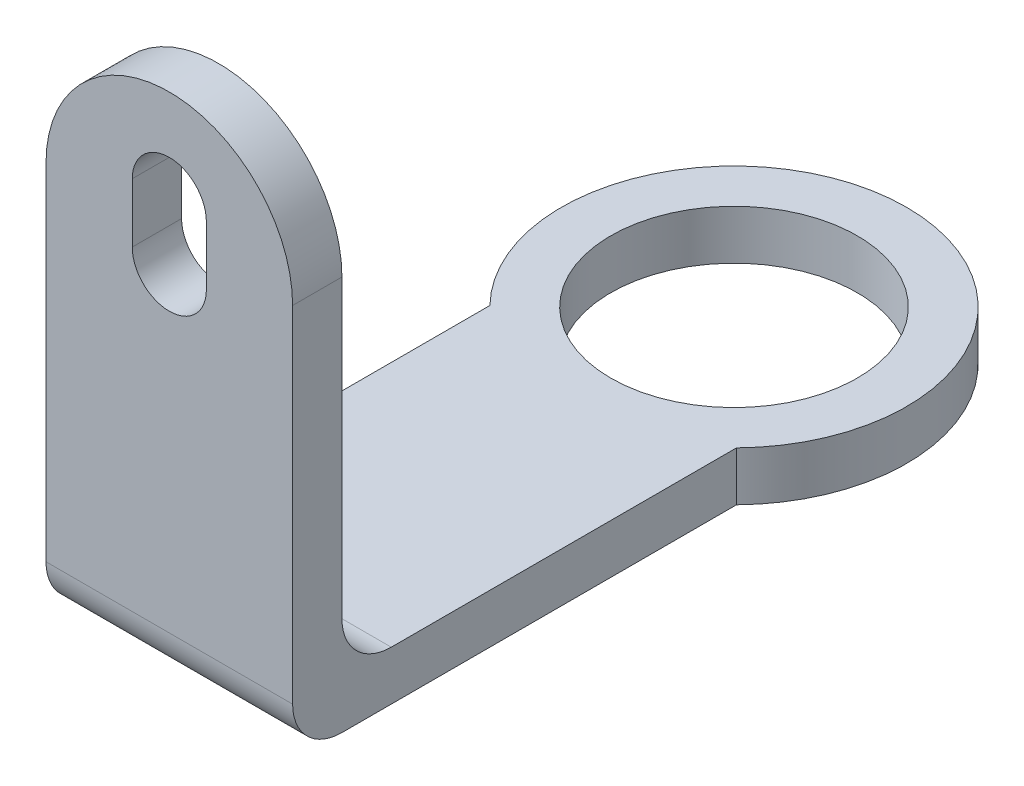
ISO-10303-21;
HEADER;
FILE_DESCRIPTION(('STEP AP214'),'2;1');
FILE_NAME('part.step','',(''),(''),'','','');
FILE_SCHEMA(('AUTOMOTIVE_DESIGN { 1 0 10303 214 1 1 1 1 }'));
ENDSEC;
DATA;
#1=APPLICATION_CONTEXT('core data for automotive mechanical design processes');
#2=APPLICATION_PROTOCOL_DEFINITION('international standard','automotive_design',2000,#1);
#3=PRODUCT_CONTEXT('',#1,'mechanical');
#4=PRODUCT('Part','Part','',(#3));
#5=PRODUCT_RELATED_PRODUCT_CATEGORY('part','',(#4));
#6=PRODUCT_DEFINITION_FORMATION('','',#4);
#7=PRODUCT_DEFINITION_CONTEXT('part definition',#1,'design');
#8=PRODUCT_DEFINITION('design','',#6,#7);
#9=PRODUCT_DEFINITION_SHAPE('','',#8);
#10=(LENGTH_UNIT() NAMED_UNIT(*) SI_UNIT(.MILLI.,.METRE.));
#11=(NAMED_UNIT(*) PLANE_ANGLE_UNIT() SI_UNIT($,.RADIAN.));
#12=(NAMED_UNIT(*) SI_UNIT($,.STERADIAN.) SOLID_ANGLE_UNIT());
#13=UNCERTAINTY_MEASURE_WITH_UNIT(LENGTH_MEASURE(1.E-05),#10,'distance_accuracy_value','');
#14=(GEOMETRIC_REPRESENTATION_CONTEXT(3) GLOBAL_UNCERTAINTY_ASSIGNED_CONTEXT((#13)) GLOBAL_UNIT_ASSIGNED_CONTEXT((#10,
#11,#12)) REPRESENTATION_CONTEXT('',''));
#15=CARTESIAN_POINT('',(0.,0.,0.));
#16=DIRECTION('',(0.,0.,1.));
#17=DIRECTION('',(1.,0.,0.));
#18=AXIS2_PLACEMENT_3D('',#15,#16,#17);
#19=CARTESIAN_POINT('',(0.,1.,0.));
#20=DIRECTION('',(0.,1.,0.));
#21=DIRECTION('',(0.,0.,1.));
#22=AXIS2_PLACEMENT_3D('',#19,#20,#21);
#23=PLANE('',#22);
#24=DIRECTION('',(0.,0.,1.));
#25=VECTOR('',#24,1.);
#26=CARTESIAN_POINT('',(-2.5,1.,2.44948974278318));
#27=LINE('',#26,#25);
#28=CARTESIAN_POINT('',(-2.5,1.,2.44948974278318));
#29=VERTEX_POINT('',#28);
#30=CARTESIAN_POINT('',(-2.5,1.,9.44948974278318));
#31=VERTEX_POINT('',#30);
#32=EDGE_CURVE('E196',#29,#31,#27,.T.);
#33=ORIENTED_EDGE('',*,*,#32,.T.);
#34=DIRECTION('',(1.,0.,0.));
#35=VECTOR('',#34,1.);
#36=CARTESIAN_POINT('',(0.,1.,9.44948974278318));
#37=LINE('',#36,#35);
#38=CARTESIAN_POINT('',(2.5,1.,9.44948974278318));
#39=VERTEX_POINT('',#38);
#40=EDGE_CURVE('E209',#31,#39,#37,.T.);
#41=ORIENTED_EDGE('',*,*,#40,.T.);
#42=DIRECTION('',(0.,0.,-1.));
#43=VECTOR('',#42,1.);
#44=CARTESIAN_POINT('',(2.5,1.,2.44948974278318));
#45=LINE('',#44,#43);
#46=CARTESIAN_POINT('',(2.5,1.,2.44948974278318));
#47=VERTEX_POINT('',#46);
#48=EDGE_CURVE('E191',#39,#47,#45,.T.);
#49=ORIENTED_EDGE('',*,*,#48,.T.);
#50=CARTESIAN_POINT('',(0.,1.,0.));
#51=DIRECTION('',(0.,1.,0.));
#52=DIRECTION('',(0.,0.,1.));
#53=AXIS2_PLACEMENT_3D('',#50,#51,#52);
#54=CIRCLE('',#53,3.5);
#55=EDGE_CURVE('E193',#47,#29,#54,.T.);
#56=ORIENTED_EDGE('',*,*,#55,.T.);
#57=EDGE_LOOP('',(#33,#41,#49,#56));
#58=FACE_BOUND('',#57,.T.);
#59=CARTESIAN_POINT('',(0.,1.,0.));
#60=DIRECTION('',(0.,1.,0.));
#61=DIRECTION('',(0.,0.,1.));
#62=AXIS2_PLACEMENT_3D('',#59,#60,#61);
#63=CIRCLE('',#62,2.5);
#64=CARTESIAN_POINT('',(0.,1.,2.5));
#65=VERTEX_POINT('',#64);
#66=EDGE_CURVE('E185',#65,#65,#63,.T.);
#67=ORIENTED_EDGE('',*,*,#66,.F.);
#68=EDGE_LOOP('',(#67));
#69=FACE_BOUND('',#68,.T.);
#70=ADVANCED_FACE('F33',(#58,#69),#23,.T.);
#71=CARTESIAN_POINT('',(0.,0.,0.));
#72=DIRECTION('',(0.,1.,0.));
#73=DIRECTION('',(0.,0.,1.));
#74=AXIS2_PLACEMENT_3D('',#71,#72,#73);
#75=PLANE('',#74);
#76=DIRECTION('',(0.,0.,-1.));
#77=VECTOR('',#76,1.);
#78=CARTESIAN_POINT('',(2.5,0.,2.44948974278318));
#79=LINE('',#78,#77);
#80=CARTESIAN_POINT('',(2.5,0.,10.4494897427832));
#81=VERTEX_POINT('',#80);
#82=CARTESIAN_POINT('',(2.5,0.,2.44948974278318));
#83=VERTEX_POINT('',#82);
#84=EDGE_CURVE('E188',#81,#83,#79,.T.);
#85=ORIENTED_EDGE('',*,*,#84,.F.);
#86=DIRECTION('',(1.,0.,0.));
#87=VECTOR('',#86,1.);
#88=CARTESIAN_POINT('',(-2.5,0.,10.4494897427832));
#89=LINE('',#88,#87);
#90=CARTESIAN_POINT('',(-2.5,0.,10.4494897427832));
#91=VERTEX_POINT('',#90);
#92=EDGE_CURVE('E48',#81,#91,#89,.F.);
#93=ORIENTED_EDGE('',*,*,#92,.T.);
#94=DIRECTION('',(0.,0.,1.));
#95=VECTOR('',#94,1.);
#96=CARTESIAN_POINT('',(-2.5,0.,2.44948974278318));
#97=LINE('',#96,#95);
#98=CARTESIAN_POINT('',(-2.5,0.,2.44948974278318));
#99=VERTEX_POINT('',#98);
#100=EDGE_CURVE('E194',#99,#91,#97,.T.);
#101=ORIENTED_EDGE('',*,*,#100,.F.);
#102=CARTESIAN_POINT('',(0.,0.,0.));
#103=DIRECTION('',(0.,1.,0.));
#104=DIRECTION('',(0.,0.,1.));
#105=AXIS2_PLACEMENT_3D('',#102,#103,#104);
#106=CIRCLE('',#105,3.5);
#107=EDGE_CURVE('E201',#83,#99,#106,.T.);
#108=ORIENTED_EDGE('',*,*,#107,.F.);
#109=EDGE_LOOP('',(#85,#93,#101,#108));
#110=FACE_BOUND('',#109,.T.);
#111=CARTESIAN_POINT('',(0.,0.,0.));
#112=DIRECTION('',(0.,1.,0.));
#113=DIRECTION('',(0.,0.,1.));
#114=AXIS2_PLACEMENT_3D('',#111,#112,#113);
#115=CIRCLE('',#114,2.5);
#116=CARTESIAN_POINT('',(0.,0.,2.5));
#117=VERTEX_POINT('',#116);
#118=EDGE_CURVE('E184',#117,#117,#115,.T.);
#119=ORIENTED_EDGE('',*,*,#118,.T.);
#120=EDGE_LOOP('',(#119));
#121=FACE_BOUND('',#120,.T.);
#122=ADVANCED_FACE('F246',(#110,#121),#75,.F.);
#123=CARTESIAN_POINT('',(2.5,1.,2.44948974278318));
#124=DIRECTION('',(-1.,0.,0.));
#125=DIRECTION('',(0.,0.,1.));
#126=AXIS2_PLACEMENT_3D('',#123,#124,#125);
#127=PLANE('',#126);
#128=DIRECTION('',(0.,1.,0.));
#129=VECTOR('',#128,1.);
#130=CARTESIAN_POINT('',(2.5,0.,11.4494897427832));
#131=LINE('',#130,#129);
#132=CARTESIAN_POINT('',(2.5,1.,11.4494897427832));
#133=VERTEX_POINT('',#132);
#134=CARTESIAN_POINT('',(2.5,8.,11.4494897427832));
#135=VERTEX_POINT('',#134);
#136=EDGE_CURVE('E165',#133,#135,#131,.T.);
#137=ORIENTED_EDGE('',*,*,#136,.F.);
#138=CARTESIAN_POINT('',(2.5,1.,10.4494897427832));
#139=DIRECTION('',(-1.,0.,0.));
#140=DIRECTION('',(0.,0.,1.));
#141=AXIS2_PLACEMENT_3D('',#138,#139,#140);
#142=CIRCLE('',#141,1.);
#143=EDGE_CURVE('E56',#133,#81,#142,.F.);
#144=ORIENTED_EDGE('',*,*,#143,.T.);
#145=ORIENTED_EDGE('',*,*,#84,.T.);
#146=DIRECTION('',(0.,-1.,0.));
#147=VECTOR('',#146,1.);
#148=CARTESIAN_POINT('',(2.5,1.,2.44948974278318));
#149=LINE('',#148,#147);
#150=EDGE_CURVE('E206',#47,#83,#149,.T.);
#151=ORIENTED_EDGE('',*,*,#150,.F.);
#152=ORIENTED_EDGE('',*,*,#48,.F.);
#153=CARTESIAN_POINT('',(2.5,2.,9.44948974278318));
#154=DIRECTION('',(-1.,0.,0.));
#155=DIRECTION('',(0.,0.,1.));
#156=AXIS2_PLACEMENT_3D('',#153,#154,#155);
#157=CIRCLE('',#156,1.);
#158=CARTESIAN_POINT('',(2.5,2.,10.4494897427832));
#159=VERTEX_POINT('',#158);
#160=EDGE_CURVE('E41',#39,#159,#157,.T.);
#161=ORIENTED_EDGE('',*,*,#160,.T.);
#162=DIRECTION('',(0.,1.,0.));
#163=VECTOR('',#162,1.);
#164=CARTESIAN_POINT('',(2.5,0.,10.4494897427832));
#165=LINE('',#164,#163);
#166=CARTESIAN_POINT('',(2.5,8.,10.4494897427832));
#167=VERTEX_POINT('',#166);
#168=EDGE_CURVE('E141',#159,#167,#165,.T.);
#169=ORIENTED_EDGE('',*,*,#168,.T.);
#170=DIRECTION('',(0.,0.,-1.));
#171=VECTOR('',#170,1.);
#172=CARTESIAN_POINT('',(2.5,8.,11.4494897427832));
#173=LINE('',#172,#171);
#174=EDGE_CURVE('E181',#135,#167,#173,.T.);
#175=ORIENTED_EDGE('',*,*,#174,.F.);
#176=EDGE_LOOP('',(#137,#144,#145,#151,#152,#161,#169,#175));
#177=FACE_BOUND('',#176,.T.);
#178=ADVANCED_FACE('F222',(#177),#127,.F.);
#179=CARTESIAN_POINT('',(0.,1.,0.));
#180=DIRECTION('',(0.,-1.,0.));
#181=DIRECTION('',(0.,0.,-1.));
#182=AXIS2_PLACEMENT_3D('',#179,#180,#181);
#183=CYLINDRICAL_SURFACE('',#182,3.5);
#184=ORIENTED_EDGE('',*,*,#107,.T.);
#185=DIRECTION('',(0.,-1.,0.));
#186=VECTOR('',#185,1.);
#187=CARTESIAN_POINT('',(-2.5,1.,2.44948974278318));
#188=LINE('',#187,#186);
#189=EDGE_CURVE('E199',#29,#99,#188,.T.);
#190=ORIENTED_EDGE('',*,*,#189,.F.);
#191=ORIENTED_EDGE('',*,*,#55,.F.);
#192=ORIENTED_EDGE('',*,*,#150,.T.);
#193=EDGE_LOOP('',(#184,#190,#191,#192));
#194=FACE_BOUND('',#193,.T.);
#195=ADVANCED_FACE('F243',(#194),#183,.T.);
#196=CARTESIAN_POINT('',(-2.5,1.,2.44948974278318));
#197=DIRECTION('',(1.,0.,0.));
#198=DIRECTION('',(0.,0.,-1.));
#199=AXIS2_PLACEMENT_3D('',#196,#197,#198);
#200=PLANE('',#199);
#201=ORIENTED_EDGE('',*,*,#100,.T.);
#202=CARTESIAN_POINT('',(-2.5,1.,10.4494897427832));
#203=DIRECTION('',(1.,0.,0.));
#204=DIRECTION('',(0.,0.,-1.));
#205=AXIS2_PLACEMENT_3D('',#202,#203,#204);
#206=CIRCLE('',#205,1.);
#207=CARTESIAN_POINT('',(-2.5,1.,11.4494897427832));
#208=VERTEX_POINT('',#207);
#209=EDGE_CURVE('E219',#91,#208,#206,.F.);
#210=ORIENTED_EDGE('',*,*,#209,.T.);
#211=DIRECTION('',(0.,-1.,0.));
#212=VECTOR('',#211,1.);
#213=CARTESIAN_POINT('',(-2.5,0.,11.4494897427832));
#214=LINE('',#213,#212);
#215=CARTESIAN_POINT('',(-2.5,8.,11.4494897427832));
#216=VERTEX_POINT('',#215);
#217=EDGE_CURVE('E170',#216,#208,#214,.T.);
#218=ORIENTED_EDGE('',*,*,#217,.F.);
#219=DIRECTION('',(0.,0.,-1.));
#220=VECTOR('',#219,1.);
#221=CARTESIAN_POINT('',(-2.5,8.,11.4494897427832));
#222=LINE('',#221,#220);
#223=CARTESIAN_POINT('',(-2.5,8.,10.4494897427832));
#224=VERTEX_POINT('',#223);
#225=EDGE_CURVE('E173',#216,#224,#222,.T.);
#226=ORIENTED_EDGE('',*,*,#225,.T.);
#227=DIRECTION('',(0.,-1.,0.));
#228=VECTOR('',#227,1.);
#229=CARTESIAN_POINT('',(-2.5,0.,10.4494897427832));
#230=LINE('',#229,#228);
#231=CARTESIAN_POINT('',(-2.5,2.,10.4494897427832));
#232=VERTEX_POINT('',#231);
#233=EDGE_CURVE('E168',#224,#232,#230,.T.);
#234=ORIENTED_EDGE('',*,*,#233,.T.);
#235=CARTESIAN_POINT('',(-2.5,2.,9.44948974278318));
#236=DIRECTION('',(1.,0.,0.));
#237=DIRECTION('',(0.,0.,-1.));
#238=AXIS2_PLACEMENT_3D('',#235,#236,#237);
#239=CIRCLE('',#238,1.);
#240=EDGE_CURVE('E11',#232,#31,#239,.T.);
#241=ORIENTED_EDGE('',*,*,#240,.T.);
#242=ORIENTED_EDGE('',*,*,#32,.F.);
#243=ORIENTED_EDGE('',*,*,#189,.T.);
#244=EDGE_LOOP('',(#201,#210,#218,#226,#234,#241,#242,#243));
#245=FACE_BOUND('',#244,.T.);
#246=ADVANCED_FACE('F237',(#245),#200,.F.);
#247=CARTESIAN_POINT('',(0.,1.,0.));
#248=DIRECTION('',(0.,-1.,0.));
#249=DIRECTION('',(0.,0.,-1.));
#250=AXIS2_PLACEMENT_3D('',#247,#248,#249);
#251=CYLINDRICAL_SURFACE('',#250,2.5);
#252=ORIENTED_EDGE('',*,*,#66,.T.);
#253=EDGE_LOOP('',(#252));
#254=FACE_BOUND('',#253,.T.);
#255=ORIENTED_EDGE('',*,*,#118,.F.);
#256=EDGE_LOOP('',(#255));
#257=FACE_BOUND('',#256,.T.);
#258=ADVANCED_FACE('F271',(#254,#257),#251,.F.);
#259=CARTESIAN_POINT('',(0.,8.,11.4494897427832));
#260=DIRECTION('',(0.,0.,1.));
#261=DIRECTION('',(1.,0.,0.));
#262=AXIS2_PLACEMENT_3D('',#259,#260,#261);
#263=PLANE('',#262);
#264=ORIENTED_EDGE('',*,*,#217,.T.);
#265=DIRECTION('',(1.,0.,0.));
#266=VECTOR('',#265,1.);
#267=CARTESIAN_POINT('',(2.5,1.,11.4494897427832));
#268=LINE('',#267,#266);
#269=EDGE_CURVE('E214',#208,#133,#268,.T.);
#270=ORIENTED_EDGE('',*,*,#269,.T.);
#271=ORIENTED_EDGE('',*,*,#136,.T.);
#272=CARTESIAN_POINT('',(0.,8.,11.4494897427832));
#273=DIRECTION('',(0.,0.,1.));
#274=DIRECTION('',(1.,0.,0.));
#275=AXIS2_PLACEMENT_3D('',#272,#273,#274);
#276=CIRCLE('',#275,2.5);
#277=EDGE_CURVE('E167',#135,#216,#276,.T.);
#278=ORIENTED_EDGE('',*,*,#277,.T.);
#279=EDGE_LOOP('',(#264,#270,#271,#278));
#280=FACE_BOUND('',#279,.T.);
#281=DIRECTION('',(0.,1.,0.));
#282=VECTOR('',#281,1.);
#283=CARTESIAN_POINT('',(0.751190726614225,7.4,11.4494897427832));
#284=LINE('',#283,#282);
#285=CARTESIAN_POINT('',(0.751190726614225,7.4,11.4494897427832));
#286=VERTEX_POINT('',#285);
#287=CARTESIAN_POINT('',(0.751190726614225,8.6,11.4494897427832));
#288=VERTEX_POINT('',#287);
#289=EDGE_CURVE('E133',#286,#288,#284,.T.);
#290=ORIENTED_EDGE('',*,*,#289,.F.);
#291=CARTESIAN_POINT('',(0.,7.4,11.4494897427832));
#292=DIRECTION('',(0.,0.,1.));
#293=DIRECTION('',(1.,0.,0.));
#294=AXIS2_PLACEMENT_3D('',#291,#292,#293);
#295=CIRCLE('',#294,0.751190726614222);
#296=CARTESIAN_POINT('',(-0.751190726614218,7.4,11.4494897427832));
#297=VERTEX_POINT('',#296);
#298=EDGE_CURVE('E123',#297,#286,#295,.T.);
#299=ORIENTED_EDGE('',*,*,#298,.F.);
#300=DIRECTION('',(0.,-1.,0.));
#301=VECTOR('',#300,1.);
#302=CARTESIAN_POINT('',(-0.751190726614218,7.4,11.4494897427832));
#303=LINE('',#302,#301);
#304=CARTESIAN_POINT('',(-0.751190726614218,8.6,11.4494897427832));
#305=VERTEX_POINT('',#304);
#306=EDGE_CURVE('E149',#305,#297,#303,.T.);
#307=ORIENTED_EDGE('',*,*,#306,.F.);
#308=CARTESIAN_POINT('',(0.,8.6,11.4494897427832));
#309=DIRECTION('',(0.,0.,1.));
#310=DIRECTION('',(1.,0.,0.));
#311=AXIS2_PLACEMENT_3D('',#308,#309,#310);
#312=CIRCLE('',#311,0.751190726614222);
#313=EDGE_CURVE('E147',#288,#305,#312,.T.);
#314=ORIENTED_EDGE('',*,*,#313,.F.);
#315=EDGE_LOOP('',(#290,#299,#307,#314));
#316=FACE_BOUND('',#315,.T.);
#317=ADVANCED_FACE('F145',(#280,#316),#263,.T.);
#318=CARTESIAN_POINT('',(0.,8.,10.4494897427832));
#319=DIRECTION('',(0.,0.,1.));
#320=DIRECTION('',(1.,0.,0.));
#321=AXIS2_PLACEMENT_3D('',#318,#319,#320);
#322=PLANE('',#321);
#323=ORIENTED_EDGE('',*,*,#168,.F.);
#324=DIRECTION('',(1.,0.,0.));
#325=VECTOR('',#324,1.);
#326=CARTESIAN_POINT('',(0.,2.,10.4494897427832));
#327=LINE('',#326,#325);
#328=EDGE_CURVE('E212',#159,#232,#327,.F.);
#329=ORIENTED_EDGE('',*,*,#328,.T.);
#330=ORIENTED_EDGE('',*,*,#233,.F.);
#331=CARTESIAN_POINT('',(0.,8.,10.4494897427832));
#332=DIRECTION('',(0.,0.,1.));
#333=DIRECTION('',(1.,0.,0.));
#334=AXIS2_PLACEMENT_3D('',#331,#332,#333);
#335=CIRCLE('',#334,2.5);
#336=EDGE_CURVE('E175',#167,#224,#335,.T.);
#337=ORIENTED_EDGE('',*,*,#336,.F.);
#338=EDGE_LOOP('',(#323,#329,#330,#337));
#339=FACE_BOUND('',#338,.T.);
#340=CARTESIAN_POINT('',(0.,7.4,10.4494897427832));
#341=DIRECTION('',(0.,0.,1.));
#342=DIRECTION('',(1.,0.,0.));
#343=AXIS2_PLACEMENT_3D('',#340,#341,#342);
#344=CIRCLE('',#343,0.751190726614222);
#345=CARTESIAN_POINT('',(-0.751190726614218,7.4,10.4494897427832));
#346=VERTEX_POINT('',#345);
#347=CARTESIAN_POINT('',(0.751190726614225,7.4,10.4494897427832));
#348=VERTEX_POINT('',#347);
#349=EDGE_CURVE('E153',#346,#348,#344,.T.);
#350=ORIENTED_EDGE('',*,*,#349,.T.);
#351=DIRECTION('',(0.,1.,0.));
#352=VECTOR('',#351,1.);
#353=CARTESIAN_POINT('',(0.751190726614225,7.4,10.4494897427832));
#354=LINE('',#353,#352);
#355=CARTESIAN_POINT('',(0.751190726614225,8.6,10.4494897427832));
#356=VERTEX_POINT('',#355);
#357=EDGE_CURVE('E140',#348,#356,#354,.T.);
#358=ORIENTED_EDGE('',*,*,#357,.T.);
#359=CARTESIAN_POINT('',(0.,8.6,10.4494897427832));
#360=DIRECTION('',(0.,0.,1.));
#361=DIRECTION('',(1.,0.,0.));
#362=AXIS2_PLACEMENT_3D('',#359,#360,#361);
#363=CIRCLE('',#362,0.751190726614222);
#364=CARTESIAN_POINT('',(-0.751190726614218,8.6,10.4494897427832));
#365=VERTEX_POINT('',#364);
#366=EDGE_CURVE('E156',#356,#365,#363,.T.);
#367=ORIENTED_EDGE('',*,*,#366,.T.);
#368=DIRECTION('',(0.,-1.,0.));
#369=VECTOR('',#368,1.);
#370=CARTESIAN_POINT('',(-0.751190726614218,7.4,10.4494897427832));
#371=LINE('',#370,#369);
#372=EDGE_CURVE('E134',#365,#346,#371,.T.);
#373=ORIENTED_EDGE('',*,*,#372,.T.);
#374=EDGE_LOOP('',(#350,#358,#367,#373));
#375=FACE_BOUND('',#374,.T.);
#376=ADVANCED_FACE('F230',(#339,#375),#322,.F.);
#377=CARTESIAN_POINT('',(0.,8.,11.4494897427832));
#378=DIRECTION('',(0.,0.,-1.));
#379=DIRECTION('',(-1.,0.,0.));
#380=AXIS2_PLACEMENT_3D('',#377,#378,#379);
#381=CYLINDRICAL_SURFACE('',#380,2.5);
#382=ORIENTED_EDGE('',*,*,#336,.T.);
#383=ORIENTED_EDGE('',*,*,#225,.F.);
#384=ORIENTED_EDGE('',*,*,#277,.F.);
#385=ORIENTED_EDGE('',*,*,#174,.T.);
#386=EDGE_LOOP('',(#382,#383,#384,#385));
#387=FACE_BOUND('',#386,.T.);
#388=ADVANCED_FACE('F255',(#387),#381,.T.);
#389=CARTESIAN_POINT('',(0.,7.4,11.4494897427832));
#390=DIRECTION('',(0.,0.,-1.));
#391=DIRECTION('',(-1.,0.,0.));
#392=AXIS2_PLACEMENT_3D('',#389,#390,#391);
#393=CYLINDRICAL_SURFACE('',#392,0.751190726614222);
#394=ORIENTED_EDGE('',*,*,#349,.F.);
#395=DIRECTION('',(0.,0.,-1.));
#396=VECTOR('',#395,1.);
#397=CARTESIAN_POINT('',(-0.751190726614218,7.4,11.4494897427832));
#398=LINE('',#397,#396);
#399=EDGE_CURVE('E129',#297,#346,#398,.T.);
#400=ORIENTED_EDGE('',*,*,#399,.F.);
#401=ORIENTED_EDGE('',*,*,#298,.T.);
#402=DIRECTION('',(0.,0.,-1.));
#403=VECTOR('',#402,1.);
#404=CARTESIAN_POINT('',(0.751190726614225,7.4,11.4494897427832));
#405=LINE('',#404,#403);
#406=EDGE_CURVE('E126',#286,#348,#405,.T.);
#407=ORIENTED_EDGE('',*,*,#406,.T.);
#408=EDGE_LOOP('',(#394,#400,#401,#407));
#409=FACE_BOUND('',#408,.T.);
#410=ADVANCED_FACE('F125',(#409),#393,.F.);
#411=CARTESIAN_POINT('',(0.751190726614225,7.4,11.4494897427832));
#412=DIRECTION('',(-1.,0.,0.));
#413=DIRECTION('',(0.,-1.,0.));
#414=AXIS2_PLACEMENT_3D('',#411,#412,#413);
#415=PLANE('',#414);
#416=ORIENTED_EDGE('',*,*,#357,.F.);
#417=ORIENTED_EDGE('',*,*,#406,.F.);
#418=ORIENTED_EDGE('',*,*,#289,.T.);
#419=DIRECTION('',(0.,0.,-1.));
#420=VECTOR('',#419,1.);
#421=CARTESIAN_POINT('',(0.751190726614225,8.6,11.4494897427832));
#422=LINE('',#421,#420);
#423=EDGE_CURVE('E142',#288,#356,#422,.T.);
#424=ORIENTED_EDGE('',*,*,#423,.T.);
#425=EDGE_LOOP('',(#416,#417,#418,#424));
#426=FACE_BOUND('',#425,.T.);
#427=ADVANCED_FACE('F137',(#426),#415,.T.);
#428=CARTESIAN_POINT('',(0.,8.6,11.4494897427832));
#429=DIRECTION('',(0.,0.,-1.));
#430=DIRECTION('',(-1.,0.,0.));
#431=AXIS2_PLACEMENT_3D('',#428,#429,#430);
#432=CYLINDRICAL_SURFACE('',#431,0.751190726614222);
#433=ORIENTED_EDGE('',*,*,#366,.F.);
#434=ORIENTED_EDGE('',*,*,#423,.F.);
#435=ORIENTED_EDGE('',*,*,#313,.T.);
#436=DIRECTION('',(0.,0.,-1.));
#437=VECTOR('',#436,1.);
#438=CARTESIAN_POINT('',(-0.751190726614218,8.6,11.4494897427832));
#439=LINE('',#438,#437);
#440=EDGE_CURVE('E162',#305,#365,#439,.T.);
#441=ORIENTED_EDGE('',*,*,#440,.T.);
#442=EDGE_LOOP('',(#433,#434,#435,#441));
#443=FACE_BOUND('',#442,.T.);
#444=ADVANCED_FACE('F284',(#443),#432,.F.);
#445=CARTESIAN_POINT('',(-0.751190726614218,7.4,11.4494897427832));
#446=DIRECTION('',(1.,0.,0.));
#447=DIRECTION('',(0.,1.,0.));
#448=AXIS2_PLACEMENT_3D('',#445,#446,#447);
#449=PLANE('',#448);
#450=ORIENTED_EDGE('',*,*,#372,.F.);
#451=ORIENTED_EDGE('',*,*,#440,.F.);
#452=ORIENTED_EDGE('',*,*,#306,.T.);
#453=ORIENTED_EDGE('',*,*,#399,.T.);
#454=EDGE_LOOP('',(#450,#451,#452,#453));
#455=FACE_BOUND('',#454,.T.);
#456=ADVANCED_FACE('F279',(#455),#449,.T.);
#457=CARTESIAN_POINT('',(0.,2.,9.44948974278318));
#458=DIRECTION('',(1.,0.,0.));
#459=DIRECTION('',(0.,0.,-1.));
#460=AXIS2_PLACEMENT_3D('',#457,#458,#459);
#461=CYLINDRICAL_SURFACE('',#460,1.);
#462=ORIENTED_EDGE('',*,*,#240,.F.);
#463=ORIENTED_EDGE('',*,*,#328,.F.);
#464=ORIENTED_EDGE('',*,*,#160,.F.);
#465=ORIENTED_EDGE('',*,*,#40,.F.);
#466=EDGE_LOOP('',(#462,#463,#464,#465));
#467=FACE_BOUND('',#466,.T.);
#468=ADVANCED_FACE('F234',(#467),#461,.F.);
#469=CARTESIAN_POINT('',(0.,1.,10.4494897427832));
#470=DIRECTION('',(-1.,0.,0.));
#471=DIRECTION('',(0.,0.,1.));
#472=AXIS2_PLACEMENT_3D('',#469,#470,#471);
#473=CYLINDRICAL_SURFACE('',#472,1.);
#474=ORIENTED_EDGE('',*,*,#209,.F.);
#475=ORIENTED_EDGE('',*,*,#92,.F.);
#476=ORIENTED_EDGE('',*,*,#143,.F.);
#477=ORIENTED_EDGE('',*,*,#269,.F.);
#478=EDGE_LOOP('',(#474,#475,#476,#477));
#479=FACE_BOUND('',#478,.T.);
#480=ADVANCED_FACE('F35',(#479),#473,.T.);
#481=CLOSED_SHELL('',(#70,#122,#178,#195,#246,#258,#317,#376,#388,#410,#427,#444,#456,#468,#480));
#482=MANIFOLD_SOLID_BREP('B2',#481);
#483=ADVANCED_BREP_SHAPE_REPRESENTATION('',(#18,#482),#14);
#484=SHAPE_DEFINITION_REPRESENTATION(#9,#483);
ENDSEC;
END-ISO-10303-21;
